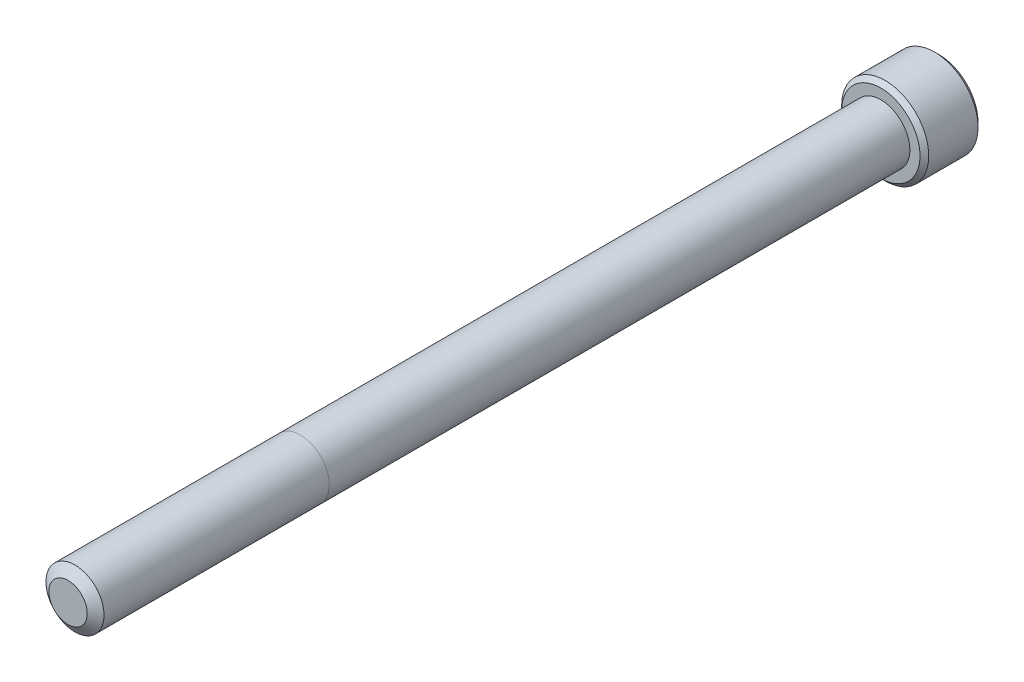
ISO-10303-21;
HEADER;
FILE_DESCRIPTION(('STEP AP214'),'2;1');
FILE_NAME('part.step','',(''),(''),'','','');
FILE_SCHEMA(('AUTOMOTIVE_DESIGN { 1 0 10303 214 1 1 1 1 }'));
ENDSEC;
DATA;
#1=APPLICATION_CONTEXT('core data for automotive mechanical design processes');
#2=APPLICATION_PROTOCOL_DEFINITION('international standard','automotive_design',2000,#1);
#3=PRODUCT_CONTEXT('',#1,'mechanical');
#4=PRODUCT('Part','Part','',(#3));
#5=PRODUCT_RELATED_PRODUCT_CATEGORY('part','',(#4));
#6=PRODUCT_DEFINITION_FORMATION('','',#4);
#7=PRODUCT_DEFINITION_CONTEXT('part definition',#1,'design');
#8=PRODUCT_DEFINITION('design','',#6,#7);
#9=PRODUCT_DEFINITION_SHAPE('','',#8);
#10=(LENGTH_UNIT() NAMED_UNIT(*) SI_UNIT(.MILLI.,.METRE.));
#11=(NAMED_UNIT(*) PLANE_ANGLE_UNIT() SI_UNIT($,.RADIAN.));
#12=(NAMED_UNIT(*) SI_UNIT($,.STERADIAN.) SOLID_ANGLE_UNIT());
#13=UNCERTAINTY_MEASURE_WITH_UNIT(LENGTH_MEASURE(1.E-05),#10,'distance_accuracy_value','');
#14=(GEOMETRIC_REPRESENTATION_CONTEXT(3) GLOBAL_UNCERTAINTY_ASSIGNED_CONTEXT((#13)) GLOBAL_UNIT_ASSIGNED_CONTEXT((#10,
#11,#12)) REPRESENTATION_CONTEXT('',''));
#15=CARTESIAN_POINT('',(0.,0.,0.));
#16=DIRECTION('',(0.,0.,1.));
#17=DIRECTION('',(1.,0.,0.));
#18=AXIS2_PLACEMENT_3D('',#15,#16,#17);
#19=CARTESIAN_POINT('',(0.,0.,-88.9));
#20=DIRECTION('',(0.,0.,1.));
#21=DIRECTION('',(1.,0.,0.));
#22=AXIS2_PLACEMENT_3D('',#19,#20,#21);
#23=CYLINDRICAL_SURFACE('',#22,3.175);
#24=CARTESIAN_POINT('',(0.,0.,-0.755446348705716));
#25=DIRECTION('',(0.,0.,1.));
#26=DIRECTION('',(1.,0.,0.));
#27=AXIS2_PLACEMENT_3D('',#24,#25,#26);
#28=CIRCLE('',#27,3.175);
#29=CARTESIAN_POINT('',(3.175,0.,-0.755446348705716));
#30=VERTEX_POINT('',#29);
#31=EDGE_CURVE('E114',#30,#30,#28,.T.);
#32=ORIENTED_EDGE('',*,*,#31,.F.);
#33=EDGE_LOOP('',(#32));
#34=FACE_BOUND('',#33,.T.);
#35=CARTESIAN_POINT('',(0.,0.,-25.4));
#36=DIRECTION('',(0.,0.,-1.));
#37=DIRECTION('',(-1.,0.,0.));
#38=AXIS2_PLACEMENT_3D('',#35,#36,#37);
#39=CIRCLE('',#38,3.175);
#40=CARTESIAN_POINT('',(3.175,0.,-25.4));
#41=VERTEX_POINT('',#40);
#42=CARTESIAN_POINT('',(-3.175,0.,-25.4));
#43=VERTEX_POINT('',#42);
#44=EDGE_CURVE('E41',#41,#43,#39,.F.);
#45=ORIENTED_EDGE('',*,*,#44,.T.);
#46=EDGE_CURVE('E11',#43,#41,#39,.F.);
#47=ORIENTED_EDGE('',*,*,#46,.T.);
#48=EDGE_LOOP('',(#45,#47));
#49=FACE_BOUND('',#48,.T.);
#50=ADVANCED_FACE('F37',(#34,#49),#23,.T.);
#51=ORIENTED_EDGE('',*,*,#46,.F.);
#52=ORIENTED_EDGE('',*,*,#44,.F.);
#53=EDGE_LOOP('',(#51,#52));
#54=FACE_BOUND('',#53,.T.);
#55=CARTESIAN_POINT('',(0.,0.,-88.9));
#56=DIRECTION('',(0.,0.,-1.));
#57=DIRECTION('',(-1.,0.,0.));
#58=AXIS2_PLACEMENT_3D('',#55,#56,#57);
#59=CIRCLE('',#58,3.175);
#60=CARTESIAN_POINT('',(-3.175,0.,-88.9));
#61=VERTEX_POINT('',#60);
#62=EDGE_CURVE('E198',#61,#61,#59,.F.);
#63=ORIENTED_EDGE('',*,*,#62,.T.);
#64=EDGE_LOOP('',(#63));
#65=FACE_BOUND('',#64,.T.);
#66=ADVANCED_FACE('F191',(#54,#65),#23,.T.);
#67=CARTESIAN_POINT('',(0.,0.,0.));
#68=DIRECTION('',(0.,0.,-1.));
#69=DIRECTION('',(-1.,0.,0.));
#70=AXIS2_PLACEMENT_3D('',#67,#68,#69);
#71=CONICAL_SURFACE('',#70,2.09611080289532,0.959931088596884);
#72=ORIENTED_EDGE('',*,*,#31,.T.);
#73=EDGE_LOOP('',(#72));
#74=FACE_BOUND('',#73,.T.);
#75=CARTESIAN_POINT('',(0.,0.,0.));
#76=DIRECTION('',(0.,0.,1.));
#77=DIRECTION('',(1.,0.,0.));
#78=AXIS2_PLACEMENT_3D('',#75,#76,#77);
#79=CIRCLE('',#78,2.09611080289532);
#80=CARTESIAN_POINT('',(2.09611080289532,0.,0.));
#81=VERTEX_POINT('',#80);
#82=EDGE_CURVE('E200',#81,#81,#79,.T.);
#83=ORIENTED_EDGE('',*,*,#82,.F.);
#84=EDGE_LOOP('',(#83));
#85=FACE_BOUND('',#84,.T.);
#86=ADVANCED_FACE('F194',(#74,#85),#71,.T.);
#87=CARTESIAN_POINT('',(0.,0.,0.));
#88=DIRECTION('',(0.,0.,1.));
#89=DIRECTION('',(1.,0.,0.));
#90=AXIS2_PLACEMENT_3D('',#87,#88,#89);
#91=PLANE('',#90);
#92=ORIENTED_EDGE('',*,*,#82,.T.);
#93=EDGE_LOOP('',(#92));
#94=FACE_BOUND('',#93,.T.);
#95=ADVANCED_FACE('F259',(#94),#91,.T.);
#96=CARTESIAN_POINT('',(0.,0.,-95.25));
#97=DIRECTION('',(0.,0.,1.));
#98=DIRECTION('',(1.,0.,0.));
#99=AXIS2_PLACEMENT_3D('',#96,#97,#98);
#100=CYLINDRICAL_SURFACE('',#99,4.7625);
#101=CARTESIAN_POINT('',(0.,0.,-94.77375));
#102=DIRECTION('',(0.,0.,-1.));
#103=DIRECTION('',(-1.,0.,0.));
#104=AXIS2_PLACEMENT_3D('',#101,#102,#103);
#105=CIRCLE('',#104,4.7625);
#106=CARTESIAN_POINT('',(-4.7625,0.,-94.77375));
#107=VERTEX_POINT('',#106);
#108=EDGE_CURVE('E182',#107,#107,#105,.F.);
#109=ORIENTED_EDGE('',*,*,#108,.T.);
#110=EDGE_LOOP('',(#109));
#111=FACE_BOUND('',#110,.T.);
#112=CARTESIAN_POINT('',(0.,0.,-89.37625));
#113=DIRECTION('',(0.,0.,-1.));
#114=DIRECTION('',(-1.,0.,0.));
#115=AXIS2_PLACEMENT_3D('',#112,#113,#114);
#116=CIRCLE('',#115,4.7625);
#117=CARTESIAN_POINT('',(-4.7625,0.,-89.37625));
#118=VERTEX_POINT('',#117);
#119=EDGE_CURVE('E179',#118,#118,#116,.T.);
#120=ORIENTED_EDGE('',*,*,#119,.T.);
#121=EDGE_LOOP('',(#120));
#122=FACE_BOUND('',#121,.T.);
#123=ADVANCED_FACE('F275',(#111,#122),#100,.T.);
#124=CARTESIAN_POINT('',(0.,0.,-95.25));
#125=DIRECTION('',(0.,0.,-1.));
#126=DIRECTION('',(-1.,0.,0.));
#127=AXIS2_PLACEMENT_3D('',#124,#125,#126);
#128=PLANE('',#127);
#129=CARTESIAN_POINT('',(0.,0.,-95.25));
#130=DIRECTION('',(0.,0.,-1.));
#131=DIRECTION('',(-1.,0.,0.));
#132=AXIS2_PLACEMENT_3D('',#129,#130,#131);
#133=CIRCLE('',#132,4.28625000000002);
#134=CARTESIAN_POINT('',(-4.28625000000002,0.,-95.25));
#135=VERTEX_POINT('',#134);
#136=EDGE_CURVE('E113',#135,#135,#133,.T.);
#137=ORIENTED_EDGE('',*,*,#136,.T.);
#138=EDGE_LOOP('',(#137));
#139=FACE_BOUND('',#138,.T.);
#140=CARTESIAN_POINT('',(0.,0.,-95.25));
#141=DIRECTION('',(0.,0.,-1.));
#142=DIRECTION('',(-1.,0.,0.));
#143=AXIS2_PLACEMENT_3D('',#140,#141,#142);
#144=CIRCLE('',#143,2.74963065701559);
#145=CARTESIAN_POINT('',(-2.38125,1.3748153285078,-95.25));
#146=VERTEX_POINT('',#145);
#147=CARTESIAN_POINT('',(0.,2.74963065701559,-95.25));
#148=VERTEX_POINT('',#147);
#149=EDGE_CURVE('E92',#146,#148,#144,.T.);
#150=ORIENTED_EDGE('',*,*,#149,.F.);
#151=CARTESIAN_POINT('',(-2.38125,-1.3748153285078,-95.25));
#152=VERTEX_POINT('',#151);
#153=EDGE_CURVE('E104',#152,#146,#144,.T.);
#154=ORIENTED_EDGE('',*,*,#153,.F.);
#155=CARTESIAN_POINT('',(0.,-2.74963065701559,-95.25));
#156=VERTEX_POINT('',#155);
#157=EDGE_CURVE('E438',#156,#152,#144,.T.);
#158=ORIENTED_EDGE('',*,*,#157,.F.);
#159=CARTESIAN_POINT('',(2.38125,-1.3748153285078,-95.25));
#160=VERTEX_POINT('',#159);
#161=EDGE_CURVE('E137',#160,#156,#144,.T.);
#162=ORIENTED_EDGE('',*,*,#161,.F.);
#163=CARTESIAN_POINT('',(2.38125,1.3748153285078,-95.25));
#164=VERTEX_POINT('',#163);
#165=EDGE_CURVE('E136',#164,#160,#144,.T.);
#166=ORIENTED_EDGE('',*,*,#165,.F.);
#167=EDGE_CURVE('E102',#148,#164,#144,.T.);
#168=ORIENTED_EDGE('',*,*,#167,.F.);
#169=EDGE_LOOP('',(#150,#154,#158,#162,#166,#168));
#170=FACE_BOUND('',#169,.T.);
#171=ADVANCED_FACE('F134',(#139,#170),#128,.T.);
#172=CARTESIAN_POINT('',(0.,0.,-88.9));
#173=DIRECTION('',(0.,0.,-1.));
#174=DIRECTION('',(-1.,0.,0.));
#175=AXIS2_PLACEMENT_3D('',#172,#173,#174);
#176=PLANE('',#175);
#177=CARTESIAN_POINT('',(0.,0.,-88.9));
#178=DIRECTION('',(0.,0.,-1.));
#179=DIRECTION('',(-1.,0.,0.));
#180=AXIS2_PLACEMENT_3D('',#177,#178,#179);
#181=CIRCLE('',#180,4.28625000000001);
#182=CARTESIAN_POINT('',(-4.28625000000001,0.,-88.9));
#183=VERTEX_POINT('',#182);
#184=EDGE_CURVE('E184',#183,#183,#181,.F.);
#185=ORIENTED_EDGE('',*,*,#184,.T.);
#186=EDGE_LOOP('',(#185));
#187=FACE_BOUND('',#186,.T.);
#188=ORIENTED_EDGE('',*,*,#62,.F.);
#189=EDGE_LOOP('',(#188));
#190=FACE_BOUND('',#189,.T.);
#191=ADVANCED_FACE('F274',(#187,#190),#176,.F.);
#192=CARTESIAN_POINT('',(0.,0.,-95.25));
#193=DIRECTION('',(0.,0.,-1.));
#194=DIRECTION('',(-1.,0.,0.));
#195=AXIS2_PLACEMENT_3D('',#192,#193,#194);
#196=CONICAL_SURFACE('',#195,2.74963065701559,0.78539816339745);
#197=ORIENTED_EDGE('',*,*,#167,.T.);
#198=CARTESIAN_POINT('',(-0.000200000000001419,2.74974612706943,-95.2501154773272));
#199=CARTESIAN_POINT('',(0.0816567823790505,2.70248609172789,-95.2028948967095));
#200=CARTESIAN_POINT('',(0.164882333771761,2.65443579722785,-95.1584475752929));
#201=CARTESIAN_POINT('',(0.334588480838041,2.556455907536,-95.0770654569856));
#202=CARTESIAN_POINT('',(0.421085217353103,2.50651699342501,-95.0401759430951));
#203=CARTESIAN_POINT('',(0.595501774009043,2.40581754748857,-94.9769834131659));
#204=CARTESIAN_POINT('',(0.683377171180676,2.35508266327638,-94.9505215587295));
#205=CARTESIAN_POINT('',(0.861062594070877,2.25249593653965,-94.909751515616));
#206=CARTESIAN_POINT('',(0.950867191185871,2.20064722822085,-94.8954128915305));
#207=CARTESIAN_POINT('',(1.10563960313034,2.11128933452158,-94.8824757847701));
#208=CARTESIAN_POINT('',(1.17040744896962,2.07389560129144,-94.8805606046532));
#209=CARTESIAN_POINT('',(1.29983727933557,1.99916925388849,-94.8837866227677));
#210=CARTESIAN_POINT('',(1.36449921879335,1.96183666573622,-94.8889302948571));
#211=CARTESIAN_POINT('',(1.4932125485774,1.88752399013711,-94.9059813108716));
#212=CARTESIAN_POINT('',(1.55726317423485,1.85054434417201,-94.9178962213493));
#213=CARTESIAN_POINT('',(1.68425683890527,1.77722451768917,-94.947835672352));
#214=CARTESIAN_POINT('',(1.74719996243582,1.74088428837517,-94.9658597445184));
#215=CARTESIAN_POINT('',(1.90842615073218,1.64780030516185,-95.0193688075524));
#216=CARTESIAN_POINT('',(2.00570949128784,1.59163374230437,-95.0588874208722));
#217=CARTESIAN_POINT('',(2.14875606262558,1.50904576583588,-95.1256003435508));
#218=CARTESIAN_POINT('',(2.19589628894397,1.48182934348129,-95.1490402091113));
#219=CARTESIAN_POINT('',(2.28930352636664,1.42790064981105,-95.1980566766595));
#220=CARTESIAN_POINT('',(2.33557105249683,1.40118808114505,-95.2236319667668));
#221=CARTESIAN_POINT('',(2.38145,1.37469985845396,-95.2501154773272));
#222=B_SPLINE_CURVE_WITH_KNOTS('',3,(#198,#199,#200,#201,#202,#203,#204,#205,#206,#207,#208,
#209,#210,#211,#212,#213,#214,#215,#216,#217,#218,#219,#220,#221),.UNSPECIFIED.,.F.,.F.,(4,2,2,
2,2,2,2,2,2,2,2,4),(0.,0.317196610611951,0.636241461041222,0.950218950629228,1.26340583824126,
1.48752413747844,1.71172100167747,1.93616888974082,2.16059957440836,2.51709639744764,
2.694861473691,2.87251813383155),.UNSPECIFIED.);
#223=EDGE_CURVE('E108',#148,#164,#222,.T.);
#224=ORIENTED_EDGE('',*,*,#223,.F.);
#225=EDGE_LOOP('',(#197,#224));
#226=FACE_BOUND('',#225,.T.);
#227=ADVANCED_FACE('F109',(#226),#196,.F.);
#228=ORIENTED_EDGE('',*,*,#165,.T.);
#229=CARTESIAN_POINT('',(2.38125,-2.74194290629281,-96.1319808948811));
#230=CARTESIAN_POINT('',(2.38125,-2.67517961094814,-96.0815846682677));
#231=CARTESIAN_POINT('',(2.38125,-2.60804251150403,-96.0316755878687));
#232=CARTESIAN_POINT('',(2.38125,-2.47287325090701,-95.9330498312406));
#233=CARTESIAN_POINT('',(2.38125,-2.40484086929573,-95.8843334574882));
#234=CARTESIAN_POINT('',(2.38125,-2.26723593537395,-95.7879648546737));
#235=CARTESIAN_POINT('',(2.38125,-2.1976555337683,-95.7403237956413));
#236=CARTESIAN_POINT('',(2.38125,-2.05731367870617,-95.6468199235723));
#237=CARTESIAN_POINT('',(2.38125,-1.98655230919793,-95.600956984903));
#238=CARTESIAN_POINT('',(2.38125,-1.83957751933871,-95.5088459008639));
#239=CARTESIAN_POINT('',(2.38125,-1.76328362015337,-95.4627255175311));
#240=CARTESIAN_POINT('',(2.38125,-1.60891357724903,-95.3735183040048));
#241=CARTESIAN_POINT('',(2.38125,-1.53083712168146,-95.330432010078));
#242=CARTESIAN_POINT('',(2.38125,-1.37291620350604,-95.2482265015513));
#243=CARTESIAN_POINT('',(2.38125,-1.29307799952833,-95.2090953579213));
#244=CARTESIAN_POINT('',(2.38125,-1.13121425104687,-95.1356679503644));
#245=CARTESIAN_POINT('',(2.38125,-1.04918943691786,-95.1013700954936));
#246=CARTESIAN_POINT('',(2.38125,-0.889535256852415,-95.0413546314484));
#247=CARTESIAN_POINT('',(2.38125,-0.812083865872973,-95.0151684784655));
#248=CARTESIAN_POINT('',(2.38125,-0.655316366649835,-94.9690097515196));
#249=CARTESIAN_POINT('',(2.38125,-0.576000130348889,-94.9490376056151));
#250=CARTESIAN_POINT('',(2.38125,-0.417295761724878,-94.9166821452753));
#251=CARTESIAN_POINT('',(2.38125,-0.337934577044903,-94.9041688083777));
#252=CARTESIAN_POINT('',(2.38125,-0.178363853149429,-94.8869738601797));
#253=CARTESIAN_POINT('',(2.38125,-0.0981544621508472,-94.8822909026206));
#254=CARTESIAN_POINT('',(2.38125,0.0594188032260106,-94.8811044408343));
#255=CARTESIAN_POINT('',(2.38125,0.136780588312047,-94.8843110104925));
#256=CARTESIAN_POINT('',(2.38125,0.290840960378523,-94.8980870567153));
#257=CARTESIAN_POINT('',(2.38125,0.36753948219955,-94.9086572485512));
#258=CARTESIAN_POINT('',(2.38125,0.521017492585625,-94.9367628297993));
#259=CARTESIAN_POINT('',(2.38125,0.597774958137446,-94.9544167488691));
#260=CARTESIAN_POINT('',(2.38125,0.749609813987386,-94.9957513961625));
#261=CARTESIAN_POINT('',(2.38125,0.824687344292223,-95.0194316201001));
#262=CARTESIAN_POINT('',(2.38125,1.06107814376439,-95.1028948628217));
#263=CARTESIAN_POINT('',(2.38125,1.21904786183134,-95.1721839268647));
#264=CARTESIAN_POINT('',(2.38125,1.4502100022134,-95.2876640836207));
#265=CARTESIAN_POINT('',(2.38125,1.52644290394184,-95.3281730569973));
#266=CARTESIAN_POINT('',(2.38125,1.67717618485051,-95.4123026889314));
#267=CARTESIAN_POINT('',(2.38125,1.75167687303396,-95.4559227867715));
#268=CARTESIAN_POINT('',(2.38125,1.89548152028665,-95.5434125561176));
#269=CARTESIAN_POINT('',(2.38125,1.9648595954743,-95.58716179235));
#270=CARTESIAN_POINT('',(2.38125,2.10242624345816,-95.6765011582982));
#271=CARTESIAN_POINT('',(2.38125,2.17061472559401,-95.7220914274512));
#272=CARTESIAN_POINT('',(2.38125,2.30540317246409,-95.8144060045998));
#273=CARTESIAN_POINT('',(2.38125,2.37201154149388,-95.8611180923826));
#274=CARTESIAN_POINT('',(2.38125,2.50431799978025,-95.9557775774644));
#275=CARTESIAN_POINT('',(2.38125,2.57001633432536,-96.0037246315223));
#276=CARTESIAN_POINT('',(2.38125,2.63533378775872,-96.0521767329484));
#277=B_SPLINE_CURVE_WITH_KNOTS('',3,(#229,#230,#231,#232,#233,#234,#235,#236,#237,#238,#239,
#240,#241,#242,#243,#244,#245,#246,#247,#248,#249,#250,#251,#252,#253,#254,#255,#256,#257,#258,
#259,#260,#261,#262,#263,#264,#265,#266,#267,#268,#269,#270,#271,#272,#273,#274,#275,#276),
.UNSPECIFIED.,.F.,.F.,(4,2,2,2,2,2,2,2,2,2,2,2,2,2,2,2,2,2,2,2,2,2,2,4),(0.,0.250951284057755,
0.501965564923436,0.754924776117814,1.00786608183833,1.2752620782364,1.54270521810292,
1.80931602064963,2.07583885853551,2.32089852628728,2.56597507150036,2.80664400340548,
3.04727155341464,3.27918940999225,3.51112979724108,3.74712477430216,3.98310000960232,
4.49898139186045,4.7579432392324,5.01685853131884,5.26288959989712,5.50893933760936,
5.75299038355428,5.9969743157828),.UNSPECIFIED.);
#278=EDGE_CURVE('E101',#164,#160,#277,.F.);
#279=ORIENTED_EDGE('',*,*,#278,.F.);
#280=EDGE_LOOP('',(#228,#279));
#281=FACE_BOUND('',#280,.T.);
#282=ADVANCED_FACE('F375',(#281),#196,.F.);
#283=ORIENTED_EDGE('',*,*,#161,.T.);
#284=CARTESIAN_POINT('',(2.38145,-1.37469985845396,-95.2501154773272));
#285=CARTESIAN_POINT('',(2.29959321762095,-1.4219598937955,-95.2028948967095));
#286=CARTESIAN_POINT('',(2.21636766622824,-1.47001018829554,-95.1584475752929));
#287=CARTESIAN_POINT('',(2.04666151916196,-1.56799007798739,-95.0770654569856));
#288=CARTESIAN_POINT('',(1.9601647826469,-1.61792899209838,-95.0401759430951));
#289=CARTESIAN_POINT('',(1.78574822599095,-1.71862843803482,-94.9769834131659));
#290=CARTESIAN_POINT('',(1.69787282881932,-1.76936332224701,-94.9505215587295));
#291=CARTESIAN_POINT('',(1.52018740592912,-1.87195004898374,-94.909751515616));
#292=CARTESIAN_POINT('',(1.43038280881413,-1.92379875730254,-94.8954128915305));
#293=CARTESIAN_POINT('',(1.27561039686966,-2.01315665100181,-94.8824757847701));
#294=CARTESIAN_POINT('',(1.21084255103038,-2.05055038423195,-94.8805606046532));
#295=CARTESIAN_POINT('',(1.08141272066442,-2.1252767316349,-94.8837866227677));
#296=CARTESIAN_POINT('',(1.01675078120664,-2.16260931978718,-94.8889302948571));
#297=CARTESIAN_POINT('',(0.888037451422599,-2.23692199538629,-94.9059813108716));
#298=CARTESIAN_POINT('',(0.823986825765142,-2.27390164135138,-94.9178962213493));
#299=CARTESIAN_POINT('',(0.696993161094722,-2.34722146783423,-94.947835672352));
#300=CARTESIAN_POINT('',(0.634050037564171,-2.38356169714823,-94.9658597445184));
#301=CARTESIAN_POINT('',(0.472823849267813,-2.47664568036155,-95.0193688075524));
#302=CARTESIAN_POINT('',(0.375540508712153,-2.53281224321902,-95.0588874208722));
#303=CARTESIAN_POINT('',(0.232493937374424,-2.61540021968751,-95.1256003435508));
#304=CARTESIAN_POINT('',(0.185353711056031,-2.6426166420421,-95.1490402091113));
#305=CARTESIAN_POINT('',(0.091946473633358,-2.69654533571234,-95.1980566766595));
#306=CARTESIAN_POINT('',(0.045678947503175,-2.72325790437834,-95.2236319667668));
#307=CARTESIAN_POINT('',(-0.000200000000005418,-2.74974612706943,-95.2501154773272));
#308=B_SPLINE_CURVE_WITH_KNOTS('',3,(#284,#285,#286,#287,#288,#289,#290,#291,#292,#293,#294,
#295,#296,#297,#298,#299,#300,#301,#302,#303,#304,#305,#306,#307),.UNSPECIFIED.,.F.,.F.,(4,2,2,
2,2,2,2,2,2,2,2,4),(0.,0.317196610611952,0.636241461041224,0.950218950629232,1.26340583824127,
1.48752413747845,1.71172100167748,1.93616888974083,2.16059957440837,2.51709639744764,
2.694861473691,2.87251813383155),.UNSPECIFIED.);
#309=EDGE_CURVE('E147',#160,#156,#308,.T.);
#310=ORIENTED_EDGE('',*,*,#309,.F.);
#311=EDGE_LOOP('',(#283,#310));
#312=FACE_BOUND('',#311,.T.);
#313=ADVANCED_FACE('F367',(#312),#196,.F.);
#314=ORIENTED_EDGE('',*,*,#157,.T.);
#315=CARTESIAN_POINT('',(0.000200000000002581,-2.74974612706943,-95.2501154773272));
#316=CARTESIAN_POINT('',(-0.081656782379047,-2.70248609172789,-95.2028948967095));
#317=CARTESIAN_POINT('',(-0.16488233377176,-2.65443579722785,-95.1584475752929));
#318=CARTESIAN_POINT('',(-0.334588480838044,-2.556455907536,-95.0770654569856));
#319=CARTESIAN_POINT('',(-0.421085217353109,-2.506516993425,-95.0401759430951));
#320=CARTESIAN_POINT('',(-0.595501774009051,-2.40581754748857,-94.9769834131659));
#321=CARTESIAN_POINT('',(-0.683377171180684,-2.35508266327638,-94.9505215587295));
#322=CARTESIAN_POINT('',(-0.861062594070885,-2.25249593653965,-94.909751515616));
#323=CARTESIAN_POINT('',(-0.95086719118588,-2.20064722822084,-94.8954128915305));
#324=CARTESIAN_POINT('',(-1.10563960313035,-2.11128933452157,-94.8824757847701));
#325=CARTESIAN_POINT('',(-1.17040744896963,-2.07389560129144,-94.8805606046532));
#326=CARTESIAN_POINT('',(-1.29983727933558,-1.99916925388848,-94.8837866227677));
#327=CARTESIAN_POINT('',(-1.36449921879337,-1.96183666573621,-94.8889302948571));
#328=CARTESIAN_POINT('',(-1.49321254857741,-1.8875239901371,-94.9059813108716));
#329=CARTESIAN_POINT('',(-1.55726317423486,-1.850544344172,-94.9178962213493));
#330=CARTESIAN_POINT('',(-1.68425683890528,-1.77722451768916,-94.947835672352));
#331=CARTESIAN_POINT('',(-1.74719996243583,-1.74088428837516,-94.9658597445184));
#332=CARTESIAN_POINT('',(-1.90842615073219,-1.64780030516184,-95.0193688075524));
#333=CARTESIAN_POINT('',(-2.00570949128785,-1.59163374230437,-95.0588874208722));
#334=CARTESIAN_POINT('',(-2.14875606262558,-1.50904576583588,-95.1256003435508));
#335=CARTESIAN_POINT('',(-2.19589628894397,-1.48182934348129,-95.1490402091113));
#336=CARTESIAN_POINT('',(-2.28930352636665,-1.42790064981105,-95.1980566766595));
#337=CARTESIAN_POINT('',(-2.33557105249683,-1.40118808114505,-95.2236319667668));
#338=CARTESIAN_POINT('',(-2.38145000000001,-1.37469985845396,-95.2501154773272));
#339=B_SPLINE_CURVE_WITH_KNOTS('',3,(#315,#316,#317,#318,#319,#320,#321,#322,#323,#324,#325,
#326,#327,#328,#329,#330,#331,#332,#333,#334,#335,#336,#337,#338),.UNSPECIFIED.,.F.,.F.,(4,2,2,
2,2,2,2,2,2,2,2,4),(0.,0.31719661061196,0.636241461041231,0.950218950629239,1.26340583824128,
1.48752413747846,1.71172100167749,1.93616888974083,2.16059957440838,2.51709639744764,
2.69486147369101,2.87251813383155),.UNSPECIFIED.);
#340=EDGE_CURVE('E236',#156,#152,#339,.T.);
#341=ORIENTED_EDGE('',*,*,#340,.F.);
#342=EDGE_LOOP('',(#314,#341));
#343=FACE_BOUND('',#342,.T.);
#344=ADVANCED_FACE('F359',(#343),#196,.F.);
#345=ORIENTED_EDGE('',*,*,#153,.T.);
#346=CARTESIAN_POINT('',(-2.38125,-2.74194290589388,-96.1319808945799));
#347=CARTESIAN_POINT('',(-2.38125,-2.67517961056041,-96.0815846679781));
#348=CARTESIAN_POINT('',(-2.38125,-2.60804251112754,-96.0316755875907));
#349=CARTESIAN_POINT('',(-2.38125,-2.47287325055308,-95.9330498309857));
#350=CARTESIAN_POINT('',(-2.38125,-2.40484086895314,-95.8843334572448));
#351=CARTESIAN_POINT('',(-2.38125,-2.26723593505442,-95.7879648544534));
#352=CARTESIAN_POINT('',(-2.38125,-2.19765553346051,-95.7403237954326));
#353=CARTESIAN_POINT('',(-2.38125,-2.05731367842205,-95.6468199233866));
#354=CARTESIAN_POINT('',(-2.38125,-1.98655230892575,-95.6009569847287));
#355=CARTESIAN_POINT('',(-2.38125,-1.83957751909227,-95.5088459007133));
#356=CARTESIAN_POINT('',(-2.38125,-1.76328361992077,-95.4627255173929));
#357=CARTESIAN_POINT('',(-2.38125,-1.60891357704462,-95.3735183038905));
#358=CARTESIAN_POINT('',(-2.38125,-1.53083712149139,-95.3304320099754));
#359=CARTESIAN_POINT('',(-2.38125,-1.37291620334516,-95.2482265014712));
#360=CARTESIAN_POINT('',(-2.38125,-1.2930779993823,-95.2090953578519));
#361=CARTESIAN_POINT('',(-2.38125,-1.13121425093134,-95.1356679503152));
#362=CARTESIAN_POINT('',(-2.38125,-1.04918943681797,-95.1013700954538));
#363=CARTESIAN_POINT('',(-2.38125,-0.889535256759283,-95.0413546314156));
#364=CARTESIAN_POINT('',(-2.38125,-0.812083865770272,-95.015168478432));
#365=CARTESIAN_POINT('',(-2.38125,-0.655316366527674,-94.9690097514868));
#366=CARTESIAN_POINT('',(-2.38125,-0.576000130216838,-94.9490376055837));
#367=CARTESIAN_POINT('',(-2.38125,-0.417295761573379,-94.9166821452488));
#368=CARTESIAN_POINT('',(-2.38125,-0.337934576883849,-94.9041688083547));
#369=CARTESIAN_POINT('',(-2.38125,-0.178363852969582,-94.8869738601659));
#370=CARTESIAN_POINT('',(-2.38125,-0.0981544619617637,-94.8822909026126));
#371=CARTESIAN_POINT('',(-2.38125,0.0594188034321333,-94.8811044408392));
#372=CARTESIAN_POINT('',(-2.38125,0.136780588525995,-94.8843110105046));
#373=CARTESIAN_POINT('',(-2.38125,0.290840960607339,-94.8980870567428));
#374=CARTESIAN_POINT('',(-2.38125,0.36753948243541,-94.9086572485871));
#375=CARTESIAN_POINT('',(-2.38125,0.521017492835388,-94.9367628298525));
#376=CARTESIAN_POINT('',(-2.38125,0.597774958394047,-94.9544167489315));
#377=CARTESIAN_POINT('',(-2.38125,0.749609814257008,-94.9957513962434));
#378=CARTESIAN_POINT('',(-2.38125,0.824687344568026,-95.0194316201903));
#379=CARTESIAN_POINT('',(-2.38125,1.06107814410025,-95.1028948629559));
#380=CARTESIAN_POINT('',(-2.38125,1.21904786221809,-95.1721839270396));
#381=CARTESIAN_POINT('',(-2.38125,1.4502100026734,-95.2876640838597));
#382=CARTESIAN_POINT('',(-2.38125,1.52644290442582,-95.3281730572583));
#383=CARTESIAN_POINT('',(-2.38125,1.6771761853817,-95.4123026892371));
#384=CARTESIAN_POINT('',(-2.38125,1.75167687358838,-95.4559227870999));
#385=CARTESIAN_POINT('',(-2.38125,1.89548152088326,-95.543412556489));
#386=CARTESIAN_POINT('',(-2.38125,1.96485959608997,-95.5871617927418));
#387=CARTESIAN_POINT('',(-2.38125,2.10242624411167,-95.6765011587306));
#388=CARTESIAN_POINT('',(-2.38125,2.17061472626632,-95.722091427904));
#389=CARTESIAN_POINT('',(-2.38125,2.30540317317352,-95.8144060050932));
#390=CARTESIAN_POINT('',(-2.38125,2.37201154222165,-95.8611180928962));
#391=CARTESIAN_POINT('',(-2.38125,2.50431800054458,-95.9557775780183));
#392=CARTESIAN_POINT('',(-2.38125,2.57001633510792,-96.0037246320963));
#393=CARTESIAN_POINT('',(-2.38125,2.63533378855947,-96.0521767335425));
#394=B_SPLINE_CURVE_WITH_KNOTS('',3,(#346,#347,#348,#349,#350,#351,#352,#353,#354,#355,#356,
#357,#358,#359,#360,#361,#362,#363,#364,#365,#366,#367,#368,#369,#370,#371,#372,#373,#374,#375,
#376,#377,#378,#379,#380,#381,#382,#383,#384,#385,#386,#387,#388,#389,#390,#391,#392,#393),
.UNSPECIFIED.,.F.,.F.,(4,2,2,2,2,2,2,2,2,2,2,2,2,2,2,2,2,2,2,2,2,2,2,4),(0.,0.250951284009984,
0.501965564827881,0.754924775973581,1.00786608164541,1.27526207798891,1.54270521780082,
1.80931602029339,2.07583885812519,2.32089852590464,2.56597507114536,2.806644003077,
3.04727155311267,3.27918940971453,3.51112979698763,3.74712477407484,3.98310000940113,
4.49898139184704,4.75794323931354,5.01685853149447,5.26288960015361,5.50893933794672,
5.75299038397142,5.99697431627971),.UNSPECIFIED.);
#395=EDGE_CURVE('E124',#152,#146,#394,.T.);
#396=ORIENTED_EDGE('',*,*,#395,.F.);
#397=EDGE_LOOP('',(#345,#396));
#398=FACE_BOUND('',#397,.T.);
#399=ADVANCED_FACE('F351',(#398),#196,.F.);
#400=ORIENTED_EDGE('',*,*,#149,.T.);
#401=CARTESIAN_POINT('',(-2.38145,1.37469985845396,-95.2501154773272));
#402=CARTESIAN_POINT('',(-2.29959321762095,1.4219598937955,-95.2028948967095));
#403=CARTESIAN_POINT('',(-2.21636766622824,1.47001018829554,-95.1584475752929));
#404=CARTESIAN_POINT('',(-2.04666151916195,1.56799007798739,-95.0770654569856));
#405=CARTESIAN_POINT('',(-1.96016478264689,1.61792899209839,-95.0401759430951));
#406=CARTESIAN_POINT('',(-1.78574822599095,1.71862843803482,-94.9769834131659));
#407=CARTESIAN_POINT('',(-1.69787282881931,1.76936332224701,-94.9505215587295));
#408=CARTESIAN_POINT('',(-1.52018740592911,1.87195004898374,-94.909751515616));
#409=CARTESIAN_POINT('',(-1.43038280881412,1.92379875730255,-94.8954128915305));
#410=CARTESIAN_POINT('',(-1.27561039686965,2.01315665100181,-94.8824757847701));
#411=CARTESIAN_POINT('',(-1.21084255103037,2.05055038423195,-94.8805606046532));
#412=CARTESIAN_POINT('',(-1.08141272066442,2.12527673163491,-94.8837866227677));
#413=CARTESIAN_POINT('',(-1.01675078120663,2.16260931978718,-94.8889302948571));
#414=CARTESIAN_POINT('',(-0.888037451422593,2.23692199538629,-94.9059813108716));
#415=CARTESIAN_POINT('',(-0.823986825765135,2.27390164135139,-94.9178962213493));
#416=CARTESIAN_POINT('',(-0.696993161094716,2.34722146783423,-94.947835672352));
#417=CARTESIAN_POINT('',(-0.634050037564165,2.38356169714823,-94.9658597445184));
#418=CARTESIAN_POINT('',(-0.472823849267809,2.47664568036155,-95.0193688075524));
#419=CARTESIAN_POINT('',(-0.375540508712151,2.53281224321902,-95.0588874208722));
#420=CARTESIAN_POINT('',(-0.232493937374425,2.61540021968751,-95.1256003435508));
#421=CARTESIAN_POINT('',(-0.185353711056031,2.6426166420421,-95.1490402091113));
#422=CARTESIAN_POINT('',(-0.0919464736333577,2.69654533571234,-95.1980566766595));
#423=CARTESIAN_POINT('',(-0.0456789475031743,2.72325790437834,-95.2236319667668));
#424=CARTESIAN_POINT('',(0.000200000000006332,2.74974612706943,-95.2501154773272));
#425=B_SPLINE_CURVE_WITH_KNOTS('',3,(#401,#402,#403,#404,#405,#406,#407,#408,#409,#410,#411,
#412,#413,#414,#415,#416,#417,#418,#419,#420,#421,#422,#423,#424),.UNSPECIFIED.,.F.,.F.,(4,2,2,
2,2,2,2,2,2,2,2,4),(0.,0.317196610611961,0.636241461041232,0.950218950629239,1.26340583824128,
1.48752413747846,1.71172100167749,1.93616888974083,2.16059957440838,2.51709639744764,
2.694861473691,2.87251813383155),.UNSPECIFIED.);
#426=EDGE_CURVE('E96',#146,#148,#425,.T.);
#427=ORIENTED_EDGE('',*,*,#426,.F.);
#428=EDGE_LOOP('',(#400,#427));
#429=FACE_BOUND('',#428,.T.);
#430=ADVANCED_FACE('F94',(#429),#196,.F.);
#431=CARTESIAN_POINT('',(2.38125,4.12444598552339,-91.678125));
#432=DIRECTION('',(0.,0.,-1.));
#433=DIRECTION('',(-1.,0.,0.));
#434=AXIS2_PLACEMENT_3D('',#431,#432,#433);
#435=PLANE('',#434);
#436=DIRECTION('',(0.866025403784439,0.5,0.));
#437=VECTOR('',#436,1.);
#438=CARTESIAN_POINT('',(-2.38125,1.3748153285078,-91.678125));
#439=LINE('',#438,#437);
#440=CARTESIAN_POINT('',(-2.38125,1.3748153285078,-91.678125));
#441=VERTEX_POINT('',#440);
#442=CARTESIAN_POINT('',(0.,2.74963065701559,-91.678125));
#443=VERTEX_POINT('',#442);
#444=EDGE_CURVE('E123',#441,#443,#439,.T.);
#445=ORIENTED_EDGE('',*,*,#444,.T.);
#446=DIRECTION('',(0.866025403784439,-0.5,0.));
#447=VECTOR('',#446,1.);
#448=CARTESIAN_POINT('',(0.,2.74963065701559,-91.678125));
#449=LINE('',#448,#447);
#450=CARTESIAN_POINT('',(2.38125,1.3748153285078,-91.678125));
#451=VERTEX_POINT('',#450);
#452=EDGE_CURVE('E128',#443,#451,#449,.T.);
#453=ORIENTED_EDGE('',*,*,#452,.T.);
#454=DIRECTION('',(0.,-1.,0.));
#455=VECTOR('',#454,1.);
#456=CARTESIAN_POINT('',(2.38125,1.3748153285078,-91.678125));
#457=LINE('',#456,#455);
#458=CARTESIAN_POINT('',(2.38125,-1.3748153285078,-91.678125));
#459=VERTEX_POINT('',#458);
#460=EDGE_CURVE('E222',#451,#459,#457,.T.);
#461=ORIENTED_EDGE('',*,*,#460,.T.);
#462=DIRECTION('',(-0.866025403784439,-0.5,0.));
#463=VECTOR('',#462,1.);
#464=CARTESIAN_POINT('',(2.38125,-1.3748153285078,-91.678125));
#465=LINE('',#464,#463);
#466=CARTESIAN_POINT('',(0.,-2.74963065701559,-91.678125));
#467=VERTEX_POINT('',#466);
#468=EDGE_CURVE('E219',#459,#467,#465,.T.);
#469=ORIENTED_EDGE('',*,*,#468,.T.);
#470=DIRECTION('',(-0.866025403784439,0.5,0.));
#471=VECTOR('',#470,1.);
#472=CARTESIAN_POINT('',(0.,-2.74963065701559,-91.678125));
#473=LINE('',#472,#471);
#474=CARTESIAN_POINT('',(-2.38125,-1.3748153285078,-91.678125));
#475=VERTEX_POINT('',#474);
#476=EDGE_CURVE('E216',#467,#475,#473,.T.);
#477=ORIENTED_EDGE('',*,*,#476,.T.);
#478=DIRECTION('',(0.,1.,0.));
#479=VECTOR('',#478,1.);
#480=CARTESIAN_POINT('',(-2.38125,-1.3748153285078,-91.678125));
#481=LINE('',#480,#479);
#482=EDGE_CURVE('E131',#475,#441,#481,.T.);
#483=ORIENTED_EDGE('',*,*,#482,.T.);
#484=EDGE_LOOP('',(#445,#453,#461,#469,#477,#483));
#485=FACE_BOUND('',#484,.T.);
#486=ADVANCED_FACE('F167',(#485),#435,.T.);
#487=CARTESIAN_POINT('',(0.,2.74963065701559,-91.678125));
#488=DIRECTION('',(0.5,0.866025403784439,0.));
#489=DIRECTION('',(-0.866025403784439,0.5,0.));
#490=AXIS2_PLACEMENT_3D('',#487,#488,#489);
#491=PLANE('',#490);
#492=DIRECTION('',(0.,0.,-1.));
#493=VECTOR('',#492,1.);
#494=CARTESIAN_POINT('',(0.,2.74963065701559,-91.678125));
#495=LINE('',#494,#493);
#496=EDGE_CURVE('E120',#443,#148,#495,.T.);
#497=ORIENTED_EDGE('',*,*,#496,.T.);
#498=ORIENTED_EDGE('',*,*,#223,.T.);
#499=DIRECTION('',(0.,0.,-1.));
#500=VECTOR('',#499,1.);
#501=CARTESIAN_POINT('',(2.38125,1.3748153285078,-91.678125));
#502=LINE('',#501,#500);
#503=EDGE_CURVE('E130',#451,#164,#502,.T.);
#504=ORIENTED_EDGE('',*,*,#503,.F.);
#505=ORIENTED_EDGE('',*,*,#452,.F.);
#506=EDGE_LOOP('',(#497,#498,#504,#505));
#507=FACE_BOUND('',#506,.T.);
#508=ADVANCED_FACE('F126',(#507),#491,.F.);
#509=CARTESIAN_POINT('',(2.38125,1.3748153285078,-91.678125));
#510=DIRECTION('',(1.,0.,0.));
#511=DIRECTION('',(0.,1.,0.));
#512=AXIS2_PLACEMENT_3D('',#509,#510,#511);
#513=PLANE('',#512);
#514=ORIENTED_EDGE('',*,*,#503,.T.);
#515=ORIENTED_EDGE('',*,*,#278,.T.);
#516=DIRECTION('',(0.,0.,-1.));
#517=VECTOR('',#516,1.);
#518=CARTESIAN_POINT('',(2.38125,-1.3748153285078,-91.678125));
#519=LINE('',#518,#517);
#520=EDGE_CURVE('E207',#459,#160,#519,.T.);
#521=ORIENTED_EDGE('',*,*,#520,.F.);
#522=ORIENTED_EDGE('',*,*,#460,.F.);
#523=EDGE_LOOP('',(#514,#515,#521,#522));
#524=FACE_BOUND('',#523,.T.);
#525=ADVANCED_FACE('F156',(#524),#513,.F.);
#526=CARTESIAN_POINT('',(2.38125,-1.3748153285078,-91.678125));
#527=DIRECTION('',(0.5,-0.866025403784439,0.));
#528=DIRECTION('',(0.866025403784439,0.5,0.));
#529=AXIS2_PLACEMENT_3D('',#526,#527,#528);
#530=PLANE('',#529);
#531=ORIENTED_EDGE('',*,*,#520,.T.);
#532=ORIENTED_EDGE('',*,*,#309,.T.);
#533=DIRECTION('',(0.,0.,-1.));
#534=VECTOR('',#533,1.);
#535=CARTESIAN_POINT('',(0.,-2.74963065701559,-91.678125));
#536=LINE('',#535,#534);
#537=EDGE_CURVE('E210',#467,#156,#536,.T.);
#538=ORIENTED_EDGE('',*,*,#537,.F.);
#539=ORIENTED_EDGE('',*,*,#468,.F.);
#540=EDGE_LOOP('',(#531,#532,#538,#539));
#541=FACE_BOUND('',#540,.T.);
#542=ADVANCED_FACE('F160',(#541),#530,.F.);
#543=CARTESIAN_POINT('',(0.,-2.74963065701559,-91.678125));
#544=DIRECTION('',(-0.5,-0.866025403784439,0.));
#545=DIRECTION('',(0.866025403784439,-0.5,0.));
#546=AXIS2_PLACEMENT_3D('',#543,#544,#545);
#547=PLANE('',#546);
#548=ORIENTED_EDGE('',*,*,#537,.T.);
#549=ORIENTED_EDGE('',*,*,#340,.T.);
#550=DIRECTION('',(0.,0.,-1.));
#551=VECTOR('',#550,1.);
#552=CARTESIAN_POINT('',(-2.38125,-1.3748153285078,-91.678125));
#553=LINE('',#552,#551);
#554=EDGE_CURVE('E203',#475,#152,#553,.T.);
#555=ORIENTED_EDGE('',*,*,#554,.F.);
#556=ORIENTED_EDGE('',*,*,#476,.F.);
#557=EDGE_LOOP('',(#548,#549,#555,#556));
#558=FACE_BOUND('',#557,.T.);
#559=ADVANCED_FACE('F244',(#558),#547,.F.);
#560=CARTESIAN_POINT('',(-2.38125,-1.3748153285078,-91.678125));
#561=DIRECTION('',(-1.,0.,0.));
#562=DIRECTION('',(0.,0.,1.));
#563=AXIS2_PLACEMENT_3D('',#560,#561,#562);
#564=PLANE('',#563);
#565=ORIENTED_EDGE('',*,*,#554,.T.);
#566=ORIENTED_EDGE('',*,*,#395,.T.);
#567=DIRECTION('',(0.,0.,-1.));
#568=VECTOR('',#567,1.);
#569=CARTESIAN_POINT('',(-2.38125,1.3748153285078,-91.678125));
#570=LINE('',#569,#568);
#571=EDGE_CURVE('E122',#441,#146,#570,.T.);
#572=ORIENTED_EDGE('',*,*,#571,.F.);
#573=ORIENTED_EDGE('',*,*,#482,.F.);
#574=EDGE_LOOP('',(#565,#566,#572,#573));
#575=FACE_BOUND('',#574,.T.);
#576=ADVANCED_FACE('F241',(#575),#564,.F.);
#577=CARTESIAN_POINT('',(-2.38125,1.3748153285078,-91.678125));
#578=DIRECTION('',(-0.5,0.866025403784439,0.));
#579=DIRECTION('',(-0.866025403784439,-0.5,0.));
#580=AXIS2_PLACEMENT_3D('',#577,#578,#579);
#581=PLANE('',#580);
#582=ORIENTED_EDGE('',*,*,#571,.T.);
#583=ORIENTED_EDGE('',*,*,#426,.T.);
#584=ORIENTED_EDGE('',*,*,#496,.F.);
#585=ORIENTED_EDGE('',*,*,#444,.F.);
#586=EDGE_LOOP('',(#582,#583,#584,#585));
#587=FACE_BOUND('',#586,.T.);
#588=ADVANCED_FACE('F118',(#587),#581,.F.);
#589=CARTESIAN_POINT('',(0.,0.,-95.25));
#590=DIRECTION('',(0.,0.,1.));
#591=DIRECTION('',(1.,0.,0.));
#592=AXIS2_PLACEMENT_3D('',#589,#590,#591);
#593=CONICAL_SURFACE('',#592,4.28625000000002,0.78539816339746);
#594=ORIENTED_EDGE('',*,*,#108,.F.);
#595=EDGE_LOOP('',(#594));
#596=FACE_BOUND('',#595,.T.);
#597=ORIENTED_EDGE('',*,*,#136,.F.);
#598=EDGE_LOOP('',(#597));
#599=FACE_BOUND('',#598,.T.);
#600=ADVANCED_FACE('F261',(#596,#599),#593,.T.);
#601=CARTESIAN_POINT('',(0.,0.,-89.37625));
#602=DIRECTION('',(0.,0.,-1.));
#603=DIRECTION('',(-1.,0.,0.));
#604=AXIS2_PLACEMENT_3D('',#601,#602,#603);
#605=CONICAL_SURFACE('',#604,4.7625,0.785398163397446);
#606=ORIENTED_EDGE('',*,*,#184,.F.);
#607=EDGE_LOOP('',(#606));
#608=FACE_BOUND('',#607,.T.);
#609=ORIENTED_EDGE('',*,*,#119,.F.);
#610=EDGE_LOOP('',(#609));
#611=FACE_BOUND('',#610,.T.);
#612=ADVANCED_FACE('F39',(#608,#611),#605,.T.);
#613=CLOSED_SHELL('',(#50,#66,#86,#95,#123,#171,#191,#227,#282,#313,#344,#399,#430,#486,#508,
#525,#542,#559,#576,#588,#600,#612));
#614=MANIFOLD_SOLID_BREP('B2',#613);
#615=ADVANCED_BREP_SHAPE_REPRESENTATION('',(#18,#614),#14);
#616=SHAPE_DEFINITION_REPRESENTATION(#9,#615);
ENDSEC;
END-ISO-10303-21;
